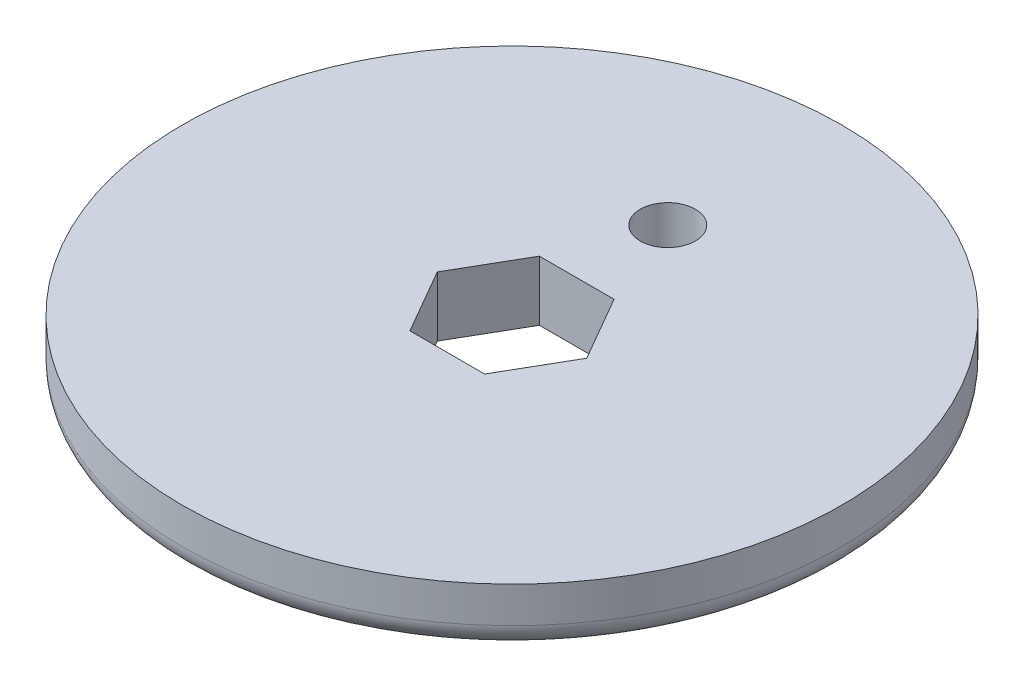
ISO-10303-21;
HEADER;
FILE_DESCRIPTION(('STEP AP214'),'2;1');
FILE_NAME('part.step','',(''),(''),'','','');
FILE_SCHEMA(('AUTOMOTIVE_DESIGN { 1 0 10303 214 1 1 1 1 }'));
ENDSEC;
DATA;
#1=APPLICATION_CONTEXT('core data for automotive mechanical design processes');
#2=APPLICATION_PROTOCOL_DEFINITION('international standard','automotive_design',2000,#1);
#3=PRODUCT_CONTEXT('',#1,'mechanical');
#4=PRODUCT('Part','Part','',(#3));
#5=PRODUCT_RELATED_PRODUCT_CATEGORY('part','',(#4));
#6=PRODUCT_DEFINITION_FORMATION('','',#4);
#7=PRODUCT_DEFINITION_CONTEXT('part definition',#1,'design');
#8=PRODUCT_DEFINITION('design','',#6,#7);
#9=PRODUCT_DEFINITION_SHAPE('','',#8);
#10=(LENGTH_UNIT() NAMED_UNIT(*) SI_UNIT(.MILLI.,.METRE.));
#11=(NAMED_UNIT(*) PLANE_ANGLE_UNIT() SI_UNIT($,.RADIAN.));
#12=(NAMED_UNIT(*) SI_UNIT($,.STERADIAN.) SOLID_ANGLE_UNIT());
#13=UNCERTAINTY_MEASURE_WITH_UNIT(LENGTH_MEASURE(1.E-05),#10,'distance_accuracy_value','');
#14=(GEOMETRIC_REPRESENTATION_CONTEXT(3) GLOBAL_UNCERTAINTY_ASSIGNED_CONTEXT((#13)) GLOBAL_UNIT_ASSIGNED_CONTEXT((#10,
#11,#12)) REPRESENTATION_CONTEXT('',''));
#15=CARTESIAN_POINT('',(0.,0.,0.));
#16=DIRECTION('',(0.,0.,1.));
#17=DIRECTION('',(1.,0.,0.));
#18=AXIS2_PLACEMENT_3D('',#15,#16,#17);
#19=CARTESIAN_POINT('',(0.,6.35,0.));
#20=DIRECTION('',(0.,1.,0.));
#21=DIRECTION('',(0.,0.,1.));
#22=AXIS2_PLACEMENT_3D('',#19,#20,#21);
#23=PLANE('',#22);
#24=CARTESIAN_POINT('',(0.,6.35,-16.51));
#25=DIRECTION('',(0.,1.,0.));
#26=DIRECTION('',(0.,0.,1.));
#27=AXIS2_PLACEMENT_3D('',#24,#25,#26);
#28=CIRCLE('',#27,2.921);
#29=CARTESIAN_POINT('',(0.,6.35,-13.589));
#30=VERTEX_POINT('',#29);
#31=EDGE_CURVE('E282',#30,#30,#28,.T.);
#32=ORIENTED_EDGE('',*,*,#31,.F.);
#33=EDGE_LOOP('',(#32));
#34=FACE_BOUND('',#33,.T.);
#35=CARTESIAN_POINT('',(0.,6.35,0.));
#36=DIRECTION('',(0.,1.,0.));
#37=DIRECTION('',(0.,0.,1.));
#38=AXIS2_PLACEMENT_3D('',#35,#36,#37);
#39=CIRCLE('',#38,34.925);
#40=CARTESIAN_POINT('',(0.,6.35,34.925));
#41=VERTEX_POINT('',#40);
#42=EDGE_CURVE('E110',#41,#41,#39,.T.);
#43=ORIENTED_EDGE('',*,*,#42,.T.);
#44=EDGE_LOOP('',(#43));
#45=FACE_BOUND('',#44,.T.);
#46=DIRECTION('',(-0.5,0.,-0.866025403784438));
#47=VECTOR('',#46,1.);
#48=CARTESIAN_POINT('',(7.9189362922049,6.35,0.));
#49=LINE('',#48,#47);
#50=CARTESIAN_POINT('',(7.9189362922049,6.35,0.));
#51=VERTEX_POINT('',#50);
#52=CARTESIAN_POINT('',(3.95946814610245,6.35,-6.858));
#53=VERTEX_POINT('',#52);
#54=EDGE_CURVE('E101',#51,#53,#49,.T.);
#55=ORIENTED_EDGE('',*,*,#54,.F.);
#56=DIRECTION('',(0.5,0.,-0.866025403784439));
#57=VECTOR('',#56,1.);
#58=CARTESIAN_POINT('',(3.95946814610245,6.35,6.858));
#59=LINE('',#58,#57);
#60=CARTESIAN_POINT('',(3.95946814610245,6.35,6.858));
#61=VERTEX_POINT('',#60);
#62=EDGE_CURVE('E92',#61,#51,#59,.T.);
#63=ORIENTED_EDGE('',*,*,#62,.F.);
#64=DIRECTION('',(1.,0.,0.));
#65=VECTOR('',#64,1.);
#66=CARTESIAN_POINT('',(-3.95946814610245,6.35,6.858));
#67=LINE('',#66,#65);
#68=CARTESIAN_POINT('',(-3.95946814610245,6.35,6.858));
#69=VERTEX_POINT('',#68);
#70=EDGE_CURVE('E128',#69,#61,#67,.T.);
#71=ORIENTED_EDGE('',*,*,#70,.F.);
#72=DIRECTION('',(0.5,0.,0.866025403784439));
#73=VECTOR('',#72,1.);
#74=CARTESIAN_POINT('',(-7.91893629220491,6.35,0.));
#75=LINE('',#74,#73);
#76=CARTESIAN_POINT('',(-7.91893629220491,6.35,0.));
#77=VERTEX_POINT('',#76);
#78=EDGE_CURVE('E125',#77,#69,#75,.T.);
#79=ORIENTED_EDGE('',*,*,#78,.F.);
#80=DIRECTION('',(-0.5,0.,0.866025403784439));
#81=VECTOR('',#80,1.);
#82=CARTESIAN_POINT('',(-3.95946814610245,6.35,-6.858));
#83=LINE('',#82,#81);
#84=CARTESIAN_POINT('',(-3.95946814610245,6.35,-6.858));
#85=VERTEX_POINT('',#84);
#86=EDGE_CURVE('E119',#85,#77,#83,.T.);
#87=ORIENTED_EDGE('',*,*,#86,.F.);
#88=DIRECTION('',(-1.,0.,0.));
#89=VECTOR('',#88,1.);
#90=CARTESIAN_POINT('',(3.95946814610245,6.35,-6.858));
#91=LINE('',#90,#89);
#92=EDGE_CURVE('E115',#53,#85,#91,.T.);
#93=ORIENTED_EDGE('',*,*,#92,.F.);
#94=EDGE_LOOP('',(#55,#63,#71,#79,#87,#93));
#95=FACE_BOUND('',#94,.T.);
#96=ADVANCED_FACE('F38',(#34,#45,#95),#23,.T.);
#97=CARTESIAN_POINT('',(0.,0.,0.));
#98=DIRECTION('',(0.,1.,0.));
#99=DIRECTION('',(0.,0.,1.));
#100=AXIS2_PLACEMENT_3D('',#97,#98,#99);
#101=PLANE('',#100);
#102=CARTESIAN_POINT('',(0.,0.,-16.51));
#103=DIRECTION('',(0.,1.,0.));
#104=DIRECTION('',(0.,0.,1.));
#105=AXIS2_PLACEMENT_3D('',#102,#103,#104);
#106=CIRCLE('',#105,2.921);
#107=CARTESIAN_POINT('',(0.,0.,-13.589));
#108=VERTEX_POINT('',#107);
#109=EDGE_CURVE('E133',#108,#108,#106,.T.);
#110=ORIENTED_EDGE('',*,*,#109,.T.);
#111=EDGE_LOOP('',(#110));
#112=FACE_BOUND('',#111,.T.);
#113=CARTESIAN_POINT('',(0.,0.,0.));
#114=DIRECTION('',(0.,1.,0.));
#115=DIRECTION('',(0.,0.,1.));
#116=AXIS2_PLACEMENT_3D('',#113,#114,#115);
#117=CIRCLE('',#116,32.385);
#118=CARTESIAN_POINT('',(0.,0.,32.385));
#119=VERTEX_POINT('',#118);
#120=EDGE_CURVE('E11',#119,#119,#117,.F.);
#121=ORIENTED_EDGE('',*,*,#120,.T.);
#122=EDGE_LOOP('',(#121));
#123=FACE_BOUND('',#122,.T.);
#124=DIRECTION('',(0.5,0.,-0.866025403784439));
#125=VECTOR('',#124,1.);
#126=CARTESIAN_POINT('',(3.95946814610245,0.,6.858));
#127=LINE('',#126,#125);
#128=CARTESIAN_POINT('',(3.95946814610245,0.,6.858));
#129=VERTEX_POINT('',#128);
#130=CARTESIAN_POINT('',(7.9189362922049,0.,0.));
#131=VERTEX_POINT('',#130);
#132=EDGE_CURVE('E62',#129,#131,#127,.T.);
#133=ORIENTED_EDGE('',*,*,#132,.T.);
#134=DIRECTION('',(-0.5,0.,-0.866025403784438));
#135=VECTOR('',#134,1.);
#136=CARTESIAN_POINT('',(7.9189362922049,0.,0.));
#137=LINE('',#136,#135);
#138=CARTESIAN_POINT('',(3.95946814610245,0.,-6.858));
#139=VERTEX_POINT('',#138);
#140=EDGE_CURVE('E108',#131,#139,#137,.T.);
#141=ORIENTED_EDGE('',*,*,#140,.T.);
#142=DIRECTION('',(-1.,0.,0.));
#143=VECTOR('',#142,1.);
#144=CARTESIAN_POINT('',(3.95946814610245,0.,-6.858));
#145=LINE('',#144,#143);
#146=CARTESIAN_POINT('',(-3.95946814610245,0.,-6.858));
#147=VERTEX_POINT('',#146);
#148=EDGE_CURVE('E136',#139,#147,#145,.T.);
#149=ORIENTED_EDGE('',*,*,#148,.T.);
#150=DIRECTION('',(-0.5,0.,0.866025403784439));
#151=VECTOR('',#150,1.);
#152=CARTESIAN_POINT('',(-3.95946814610245,0.,-6.858));
#153=LINE('',#152,#151);
#154=CARTESIAN_POINT('',(-7.91893629220491,0.,0.));
#155=VERTEX_POINT('',#154);
#156=EDGE_CURVE('E140',#147,#155,#153,.T.);
#157=ORIENTED_EDGE('',*,*,#156,.T.);
#158=DIRECTION('',(0.5,0.,0.866025403784439));
#159=VECTOR('',#158,1.);
#160=CARTESIAN_POINT('',(-7.91893629220491,0.,0.));
#161=LINE('',#160,#159);
#162=CARTESIAN_POINT('',(-3.95946814610245,0.,6.858));
#163=VERTEX_POINT('',#162);
#164=EDGE_CURVE('E144',#155,#163,#161,.T.);
#165=ORIENTED_EDGE('',*,*,#164,.T.);
#166=DIRECTION('',(1.,0.,0.));
#167=VECTOR('',#166,1.);
#168=CARTESIAN_POINT('',(-3.95946814610245,0.,6.858));
#169=LINE('',#168,#167);
#170=EDGE_CURVE('E102',#163,#129,#169,.T.);
#171=ORIENTED_EDGE('',*,*,#170,.T.);
#172=EDGE_LOOP('',(#133,#141,#149,#157,#165,#171));
#173=FACE_BOUND('',#172,.T.);
#174=ADVANCED_FACE('F186',(#112,#123,#173),#101,.F.);
#175=CARTESIAN_POINT('',(0.,6.35,0.));
#176=DIRECTION('',(0.,-1.,0.));
#177=DIRECTION('',(0.,0.,-1.));
#178=AXIS2_PLACEMENT_3D('',#175,#176,#177);
#179=CYLINDRICAL_SURFACE('',#178,34.925);
#180=CARTESIAN_POINT('',(0.,2.54,0.));
#181=DIRECTION('',(0.,1.,0.));
#182=DIRECTION('',(0.,0.,1.));
#183=AXIS2_PLACEMENT_3D('',#180,#181,#182);
#184=CIRCLE('',#183,34.925);
#185=CARTESIAN_POINT('',(0.,2.54,34.925));
#186=VERTEX_POINT('',#185);
#187=EDGE_CURVE('E47',#186,#186,#184,.T.);
#188=ORIENTED_EDGE('',*,*,#187,.T.);
#189=EDGE_LOOP('',(#188));
#190=FACE_BOUND('',#189,.T.);
#191=ORIENTED_EDGE('',*,*,#42,.F.);
#192=EDGE_LOOP('',(#191));
#193=FACE_BOUND('',#192,.T.);
#194=ADVANCED_FACE('F169',(#190,#193),#179,.T.);
#195=CARTESIAN_POINT('',(3.95946814610245,6.35,6.858));
#196=DIRECTION('',(-0.866025403784439,0.,-0.5));
#197=DIRECTION('',(-0.5,0.,0.866025403784439));
#198=AXIS2_PLACEMENT_3D('',#195,#196,#197);
#199=PLANE('',#198);
#200=ORIENTED_EDGE('',*,*,#132,.F.);
#201=DIRECTION('',(0.,-1.,0.));
#202=VECTOR('',#201,1.);
#203=CARTESIAN_POINT('',(3.95946814610245,6.35,6.858));
#204=LINE('',#203,#202);
#205=EDGE_CURVE('E96',#61,#129,#204,.T.);
#206=ORIENTED_EDGE('',*,*,#205,.F.);
#207=ORIENTED_EDGE('',*,*,#62,.T.);
#208=DIRECTION('',(0.,-1.,0.));
#209=VECTOR('',#208,1.);
#210=CARTESIAN_POINT('',(7.9189362922049,6.35,0.));
#211=LINE('',#210,#209);
#212=EDGE_CURVE('E95',#51,#131,#211,.T.);
#213=ORIENTED_EDGE('',*,*,#212,.T.);
#214=EDGE_LOOP('',(#200,#206,#207,#213));
#215=FACE_BOUND('',#214,.T.);
#216=ADVANCED_FACE('F94',(#215),#199,.T.);
#217=CARTESIAN_POINT('',(7.9189362922049,6.35,0.));
#218=DIRECTION('',(-0.866025403784439,0.,0.5));
#219=DIRECTION('',(0.5,0.,0.866025403784439));
#220=AXIS2_PLACEMENT_3D('',#217,#218,#219);
#221=PLANE('',#220);
#222=ORIENTED_EDGE('',*,*,#140,.F.);
#223=ORIENTED_EDGE('',*,*,#212,.F.);
#224=ORIENTED_EDGE('',*,*,#54,.T.);
#225=DIRECTION('',(0.,-1.,0.));
#226=VECTOR('',#225,1.);
#227=CARTESIAN_POINT('',(3.95946814610245,6.35,-6.858));
#228=LINE('',#227,#226);
#229=EDGE_CURVE('E111',#53,#139,#228,.T.);
#230=ORIENTED_EDGE('',*,*,#229,.T.);
#231=EDGE_LOOP('',(#222,#223,#224,#230));
#232=FACE_BOUND('',#231,.T.);
#233=ADVANCED_FACE('F105',(#232),#221,.T.);
#234=CARTESIAN_POINT('',(3.95946814610245,6.35,-6.858));
#235=DIRECTION('',(0.,0.,1.));
#236=DIRECTION('',(1.,0.,0.));
#237=AXIS2_PLACEMENT_3D('',#234,#235,#236);
#238=PLANE('',#237);
#239=ORIENTED_EDGE('',*,*,#148,.F.);
#240=ORIENTED_EDGE('',*,*,#229,.F.);
#241=ORIENTED_EDGE('',*,*,#92,.T.);
#242=DIRECTION('',(0.,-1.,0.));
#243=VECTOR('',#242,1.);
#244=CARTESIAN_POINT('',(-3.95946814610245,6.35,-6.858));
#245=LINE('',#244,#243);
#246=EDGE_CURVE('E158',#85,#147,#245,.T.);
#247=ORIENTED_EDGE('',*,*,#246,.T.);
#248=EDGE_LOOP('',(#239,#240,#241,#247));
#249=FACE_BOUND('',#248,.T.);
#250=ADVANCED_FACE('F206',(#249),#238,.T.);
#251=CARTESIAN_POINT('',(-3.95946814610245,6.35,-6.858));
#252=DIRECTION('',(0.866025403784439,0.,0.5));
#253=DIRECTION('',(0.5,0.,-0.866025403784439));
#254=AXIS2_PLACEMENT_3D('',#251,#252,#253);
#255=PLANE('',#254);
#256=ORIENTED_EDGE('',*,*,#156,.F.);
#257=ORIENTED_EDGE('',*,*,#246,.F.);
#258=ORIENTED_EDGE('',*,*,#86,.T.);
#259=DIRECTION('',(0.,-1.,0.));
#260=VECTOR('',#259,1.);
#261=CARTESIAN_POINT('',(-7.91893629220491,6.35,0.));
#262=LINE('',#261,#260);
#263=EDGE_CURVE('E155',#77,#155,#262,.T.);
#264=ORIENTED_EDGE('',*,*,#263,.T.);
#265=EDGE_LOOP('',(#256,#257,#258,#264));
#266=FACE_BOUND('',#265,.T.);
#267=ADVANCED_FACE('F210',(#266),#255,.T.);
#268=CARTESIAN_POINT('',(-7.91893629220491,6.35,0.));
#269=DIRECTION('',(0.866025403784438,0.,-0.5));
#270=DIRECTION('',(-0.5,0.,-0.866025403784439));
#271=AXIS2_PLACEMENT_3D('',#268,#269,#270);
#272=PLANE('',#271);
#273=ORIENTED_EDGE('',*,*,#164,.F.);
#274=ORIENTED_EDGE('',*,*,#263,.F.);
#275=ORIENTED_EDGE('',*,*,#78,.T.);
#276=DIRECTION('',(0.,-1.,0.));
#277=VECTOR('',#276,1.);
#278=CARTESIAN_POINT('',(-3.95946814610245,6.35,6.858));
#279=LINE('',#278,#277);
#280=EDGE_CURVE('E54',#69,#163,#279,.T.);
#281=ORIENTED_EDGE('',*,*,#280,.T.);
#282=EDGE_LOOP('',(#273,#274,#275,#281));
#283=FACE_BOUND('',#282,.T.);
#284=ADVANCED_FACE('F182',(#283),#272,.T.);
#285=CARTESIAN_POINT('',(-3.95946814610245,6.35,6.858));
#286=DIRECTION('',(0.,0.,-1.));
#287=DIRECTION('',(-1.,0.,0.));
#288=AXIS2_PLACEMENT_3D('',#285,#286,#287);
#289=PLANE('',#288);
#290=ORIENTED_EDGE('',*,*,#170,.F.);
#291=ORIENTED_EDGE('',*,*,#280,.F.);
#292=ORIENTED_EDGE('',*,*,#70,.T.);
#293=ORIENTED_EDGE('',*,*,#205,.T.);
#294=EDGE_LOOP('',(#290,#291,#292,#293));
#295=FACE_BOUND('',#294,.T.);
#296=ADVANCED_FACE('F174',(#295),#289,.T.);
#297=CARTESIAN_POINT('',(0.,2.54,0.));
#298=DIRECTION('',(0.,1.,0.));
#299=DIRECTION('',(0.,0.,1.));
#300=AXIS2_PLACEMENT_3D('',#297,#298,#299);
#301=TOROIDAL_SURFACE('',#300,32.385,2.54);
#302=ORIENTED_EDGE('',*,*,#120,.F.);
#303=EDGE_LOOP('',(#302));
#304=FACE_BOUND('',#303,.T.);
#305=ORIENTED_EDGE('',*,*,#187,.F.);
#306=EDGE_LOOP('',(#305));
#307=FACE_BOUND('',#306,.T.);
#308=ADVANCED_FACE('F40',(#304,#307),#301,.T.);
#309=CARTESIAN_POINT('',(0.,0.,-16.51));
#310=DIRECTION('',(0.,1.,0.));
#311=DIRECTION('',(0.,0.,1.));
#312=AXIS2_PLACEMENT_3D('',#309,#310,#311);
#313=CYLINDRICAL_SURFACE('',#312,2.921);
#314=ORIENTED_EDGE('',*,*,#109,.F.);
#315=EDGE_LOOP('',(#314));
#316=FACE_BOUND('',#315,.T.);
#317=ORIENTED_EDGE('',*,*,#31,.T.);
#318=EDGE_LOOP('',(#317));
#319=FACE_BOUND('',#318,.T.);
#320=ADVANCED_FACE('F173',(#316,#319),#313,.F.);
#321=CLOSED_SHELL('',(#96,#174,#194,#216,#233,#250,#267,#284,#296,#308,#320));
#322=MANIFOLD_SOLID_BREP('B2',#321);
#323=ADVANCED_BREP_SHAPE_REPRESENTATION('',(#18,#322),#14);
#324=SHAPE_DEFINITION_REPRESENTATION(#9,#323);
ENDSEC;
END-ISO-10303-21;
